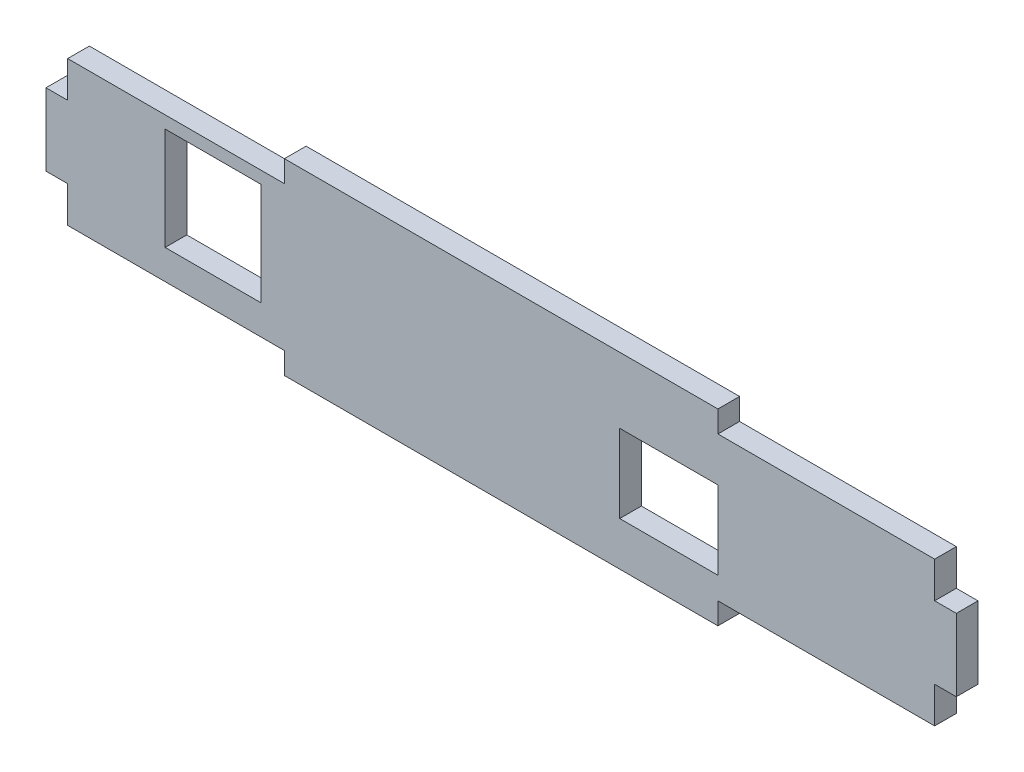
ISO-10303-21;
HEADER;
FILE_DESCRIPTION(('STEP AP214'),'2;1');
FILE_NAME('part.step','',(''),(''),'','','');
FILE_SCHEMA(('AUTOMOTIVE_DESIGN { 1 0 10303 214 1 1 1 1 }'));
ENDSEC;
DATA;
#1=APPLICATION_CONTEXT('core data for automotive mechanical design processes');
#2=APPLICATION_PROTOCOL_DEFINITION('international standard','automotive_design',2000,#1);
#3=PRODUCT_CONTEXT('',#1,'mechanical');
#4=PRODUCT('Part','Part','',(#3));
#5=PRODUCT_RELATED_PRODUCT_CATEGORY('part','',(#4));
#6=PRODUCT_DEFINITION_FORMATION('','',#4);
#7=PRODUCT_DEFINITION_CONTEXT('part definition',#1,'design');
#8=PRODUCT_DEFINITION('design','',#6,#7);
#9=PRODUCT_DEFINITION_SHAPE('','',#8);
#10=(LENGTH_UNIT() NAMED_UNIT(*) SI_UNIT(.MILLI.,.METRE.));
#11=(NAMED_UNIT(*) PLANE_ANGLE_UNIT() SI_UNIT($,.RADIAN.));
#12=(NAMED_UNIT(*) SI_UNIT($,.STERADIAN.) SOLID_ANGLE_UNIT());
#13=UNCERTAINTY_MEASURE_WITH_UNIT(LENGTH_MEASURE(1.E-05),#10,'distance_accuracy_value','');
#14=(GEOMETRIC_REPRESENTATION_CONTEXT(3) GLOBAL_UNCERTAINTY_ASSIGNED_CONTEXT((#13)) GLOBAL_UNIT_ASSIGNED_CONTEXT((#10,
#11,#12)) REPRESENTATION_CONTEXT('',''));
#15=CARTESIAN_POINT('',(0.,0.,0.));
#16=DIRECTION('',(0.,0.,1.));
#17=DIRECTION('',(1.,0.,0.));
#18=AXIS2_PLACEMENT_3D('',#15,#16,#17);
#19=CARTESIAN_POINT('',(0.,0.,3.));
#20=DIRECTION('',(0.,0.,-1.));
#21=DIRECTION('',(-1.,0.,0.));
#22=AXIS2_PLACEMENT_3D('',#19,#20,#21);
#23=PLANE('',#22);
#24=DIRECTION('',(0.,1.,0.));
#25=VECTOR('',#24,1.);
#26=CARTESIAN_POINT('',(26.7515675340596,18.2997167251893,3.));
#27=LINE('',#26,#25);
#28=CARTESIAN_POINT('',(26.7515675340596,4.10248715199374,3.));
#29=VERTEX_POINT('',#28);
#30=CARTESIAN_POINT('',(26.7515675340596,18.2997167251893,3.));
#31=VERTEX_POINT('',#30);
#32=EDGE_CURVE('E254',#29,#31,#27,.T.);
#33=ORIENTED_EDGE('',*,*,#32,.F.);
#34=DIRECTION('',(1.,0.,0.));
#35=VECTOR('',#34,1.);
#36=CARTESIAN_POINT('',(26.7515675340596,4.10248715199374,3.));
#37=LINE('',#36,#35);
#38=CARTESIAN_POINT('',(13.4899720015045,4.10248715199374,3.));
#39=VERTEX_POINT('',#38);
#40=EDGE_CURVE('E262',#39,#29,#37,.T.);
#41=ORIENTED_EDGE('',*,*,#40,.F.);
#42=DIRECTION('',(0.,-1.,0.));
#43=VECTOR('',#42,1.);
#44=CARTESIAN_POINT('',(13.4899720015045,18.2997167251893,3.));
#45=LINE('',#44,#43);
#46=CARTESIAN_POINT('',(13.4899720015045,18.2997167251893,3.));
#47=VERTEX_POINT('',#46);
#48=EDGE_CURVE('E259',#47,#39,#45,.T.);
#49=ORIENTED_EDGE('',*,*,#48,.F.);
#50=DIRECTION('',(-1.,0.,0.));
#51=VECTOR('',#50,1.);
#52=CARTESIAN_POINT('',(26.7515675340596,18.2997167251893,3.));
#53=LINE('',#52,#51);
#54=EDGE_CURVE('E256',#31,#47,#53,.T.);
#55=ORIENTED_EDGE('',*,*,#54,.F.);
#56=EDGE_LOOP('',(#33,#41,#49,#55));
#57=FACE_BOUND('',#56,.T.);
#58=DIRECTION('',(1.,0.,0.));
#59=VECTOR('',#58,1.);
#60=CARTESIAN_POINT('',(30.,0.,3.));
#61=LINE('',#60,#59);
#62=CARTESIAN_POINT('',(0.,0.,3.));
#63=VERTEX_POINT('',#62);
#64=CARTESIAN_POINT('',(30.,0.,3.));
#65=VERTEX_POINT('',#64);
#66=EDGE_CURVE('E285',#63,#65,#61,.T.);
#67=ORIENTED_EDGE('',*,*,#66,.T.);
#68=DIRECTION('',(0.,-1.,0.));
#69=VECTOR('',#68,1.);
#70=CARTESIAN_POINT('',(30.,-3.,3.));
#71=LINE('',#70,#69);
#72=CARTESIAN_POINT('',(30.,-3.,3.));
#73=VERTEX_POINT('',#72);
#74=EDGE_CURVE('E288',#65,#73,#71,.T.);
#75=ORIENTED_EDGE('',*,*,#74,.T.);
#76=DIRECTION('',(1.,0.,0.));
#77=VECTOR('',#76,1.);
#78=CARTESIAN_POINT('',(90.,-3.,3.));
#79=LINE('',#78,#77);
#80=CARTESIAN_POINT('',(90.,-3.,3.));
#81=VERTEX_POINT('',#80);
#82=EDGE_CURVE('E291',#73,#81,#79,.T.);
#83=ORIENTED_EDGE('',*,*,#82,.T.);
#84=DIRECTION('',(0.,1.,0.));
#85=VECTOR('',#84,1.);
#86=CARTESIAN_POINT('',(90.,0.,3.));
#87=LINE('',#86,#85);
#88=CARTESIAN_POINT('',(90.,0.,3.));
#89=VERTEX_POINT('',#88);
#90=EDGE_CURVE('E293',#81,#89,#87,.T.);
#91=ORIENTED_EDGE('',*,*,#90,.T.);
#92=DIRECTION('',(1.,0.,0.));
#93=VECTOR('',#92,1.);
#94=CARTESIAN_POINT('',(120.,0.,3.));
#95=LINE('',#94,#93);
#96=CARTESIAN_POINT('',(120.,0.,3.));
#97=VERTEX_POINT('',#96);
#98=EDGE_CURVE('E295',#89,#97,#95,.T.);
#99=ORIENTED_EDGE('',*,*,#98,.T.);
#100=DIRECTION('',(0.,1.,0.));
#101=VECTOR('',#100,1.);
#102=CARTESIAN_POINT('',(120.,5.00000000000001,3.));
#103=LINE('',#102,#101);
#104=CARTESIAN_POINT('',(120.,5.00000000000001,3.));
#105=VERTEX_POINT('',#104);
#106=EDGE_CURVE('E297',#97,#105,#103,.T.);
#107=ORIENTED_EDGE('',*,*,#106,.T.);
#108=DIRECTION('',(1.,0.,0.));
#109=VECTOR('',#108,1.);
#110=CARTESIAN_POINT('',(123.,5.00000000000001,3.));
#111=LINE('',#110,#109);
#112=CARTESIAN_POINT('',(123.,5.00000000000001,3.));
#113=VERTEX_POINT('',#112);
#114=EDGE_CURVE('E299',#105,#113,#111,.T.);
#115=ORIENTED_EDGE('',*,*,#114,.T.);
#116=DIRECTION('',(0.,1.,0.));
#117=VECTOR('',#116,1.);
#118=CARTESIAN_POINT('',(123.,15.,3.));
#119=LINE('',#118,#117);
#120=CARTESIAN_POINT('',(123.,15.,3.));
#121=VERTEX_POINT('',#120);
#122=EDGE_CURVE('E301',#113,#121,#119,.T.);
#123=ORIENTED_EDGE('',*,*,#122,.T.);
#124=DIRECTION('',(-1.,0.,0.));
#125=VECTOR('',#124,1.);
#126=CARTESIAN_POINT('',(120.,15.,3.));
#127=LINE('',#126,#125);
#128=CARTESIAN_POINT('',(120.,15.,3.));
#129=VERTEX_POINT('',#128);
#130=EDGE_CURVE('E303',#121,#129,#127,.T.);
#131=ORIENTED_EDGE('',*,*,#130,.T.);
#132=DIRECTION('',(0.,1.,0.));
#133=VECTOR('',#132,1.);
#134=CARTESIAN_POINT('',(120.,20.,3.));
#135=LINE('',#134,#133);
#136=CARTESIAN_POINT('',(120.,20.,3.));
#137=VERTEX_POINT('',#136);
#138=EDGE_CURVE('E305',#129,#137,#135,.T.);
#139=ORIENTED_EDGE('',*,*,#138,.T.);
#140=DIRECTION('',(-1.,0.,0.));
#141=VECTOR('',#140,1.);
#142=CARTESIAN_POINT('',(90.,20.,3.));
#143=LINE('',#142,#141);
#144=CARTESIAN_POINT('',(90.,20.,3.));
#145=VERTEX_POINT('',#144);
#146=EDGE_CURVE('E307',#137,#145,#143,.T.);
#147=ORIENTED_EDGE('',*,*,#146,.T.);
#148=DIRECTION('',(0.,1.,0.));
#149=VECTOR('',#148,1.);
#150=CARTESIAN_POINT('',(90.,23.,3.));
#151=LINE('',#150,#149);
#152=CARTESIAN_POINT('',(90.,23.,3.));
#153=VERTEX_POINT('',#152);
#154=EDGE_CURVE('E309',#145,#153,#151,.T.);
#155=ORIENTED_EDGE('',*,*,#154,.T.);
#156=DIRECTION('',(-1.,0.,0.));
#157=VECTOR('',#156,1.);
#158=CARTESIAN_POINT('',(30.,23.,3.));
#159=LINE('',#158,#157);
#160=CARTESIAN_POINT('',(30.,23.,3.));
#161=VERTEX_POINT('',#160);
#162=EDGE_CURVE('E311',#153,#161,#159,.T.);
#163=ORIENTED_EDGE('',*,*,#162,.T.);
#164=DIRECTION('',(0.,-1.,0.));
#165=VECTOR('',#164,1.);
#166=CARTESIAN_POINT('',(30.,20.,3.));
#167=LINE('',#166,#165);
#168=CARTESIAN_POINT('',(30.,20.,3.));
#169=VERTEX_POINT('',#168);
#170=EDGE_CURVE('E313',#161,#169,#167,.T.);
#171=ORIENTED_EDGE('',*,*,#170,.T.);
#172=DIRECTION('',(-1.,0.,0.));
#173=VECTOR('',#172,1.);
#174=CARTESIAN_POINT('',(0.,20.,3.));
#175=LINE('',#174,#173);
#176=CARTESIAN_POINT('',(0.,20.,3.));
#177=VERTEX_POINT('',#176);
#178=EDGE_CURVE('E315',#169,#177,#175,.T.);
#179=ORIENTED_EDGE('',*,*,#178,.T.);
#180=DIRECTION('',(0.,-1.,0.));
#181=VECTOR('',#180,1.);
#182=CARTESIAN_POINT('',(0.,15.,3.));
#183=LINE('',#182,#181);
#184=CARTESIAN_POINT('',(0.,15.,3.));
#185=VERTEX_POINT('',#184);
#186=EDGE_CURVE('E317',#177,#185,#183,.T.);
#187=ORIENTED_EDGE('',*,*,#186,.T.);
#188=DIRECTION('',(-1.,0.,0.));
#189=VECTOR('',#188,1.);
#190=CARTESIAN_POINT('',(-3.,15.,3.));
#191=LINE('',#190,#189);
#192=CARTESIAN_POINT('',(-3.,15.,3.));
#193=VERTEX_POINT('',#192);
#194=EDGE_CURVE('E319',#185,#193,#191,.T.);
#195=ORIENTED_EDGE('',*,*,#194,.T.);
#196=DIRECTION('',(0.,-1.,0.));
#197=VECTOR('',#196,1.);
#198=CARTESIAN_POINT('',(-3.,4.99999999999999,3.));
#199=LINE('',#198,#197);
#200=CARTESIAN_POINT('',(-3.,4.99999999999999,3.));
#201=VERTEX_POINT('',#200);
#202=EDGE_CURVE('E321',#193,#201,#199,.T.);
#203=ORIENTED_EDGE('',*,*,#202,.T.);
#204=DIRECTION('',(1.,0.,0.));
#205=VECTOR('',#204,1.);
#206=CARTESIAN_POINT('',(0.,4.99999999999999,3.));
#207=LINE('',#206,#205);
#208=CARTESIAN_POINT('',(0.,4.99999999999999,3.));
#209=VERTEX_POINT('',#208);
#210=EDGE_CURVE('E323',#201,#209,#207,.T.);
#211=ORIENTED_EDGE('',*,*,#210,.T.);
#212=DIRECTION('',(0.,-1.,0.));
#213=VECTOR('',#212,1.);
#214=CARTESIAN_POINT('',(0.,0.,3.));
#215=LINE('',#214,#213);
#216=EDGE_CURVE('E325',#209,#63,#215,.T.);
#217=ORIENTED_EDGE('',*,*,#216,.T.);
#218=EDGE_LOOP('',(#67,#75,#83,#91,#99,#107,#115,#123,#131,#139,#147,#155,#163,#171,#179,#187,
#195,#203,#211,#217));
#219=FACE_BOUND('',#218,.T.);
#220=DIRECTION('',(0.,1.,0.));
#221=VECTOR('',#220,1.);
#222=CARTESIAN_POINT('',(90.,13.8881165109244,3.));
#223=LINE('',#222,#221);
#224=CARTESIAN_POINT('',(90.,3.06662423825959,3.));
#225=VERTEX_POINT('',#224);
#226=CARTESIAN_POINT('',(90.,13.8881165109244,3.));
#227=VERTEX_POINT('',#226);
#228=EDGE_CURVE('E218',#225,#227,#223,.T.);
#229=ORIENTED_EDGE('',*,*,#228,.F.);
#230=DIRECTION('',(1.,0.,0.));
#231=VECTOR('',#230,1.);
#232=CARTESIAN_POINT('',(90.,3.06662423825959,3.));
#233=LINE('',#232,#231);
#234=CARTESIAN_POINT('',(76.4100716771545,3.06662423825959,3.));
#235=VERTEX_POINT('',#234);
#236=EDGE_CURVE('E240',#235,#225,#233,.T.);
#237=ORIENTED_EDGE('',*,*,#236,.F.);
#238=DIRECTION('',(0.,-1.,0.));
#239=VECTOR('',#238,1.);
#240=CARTESIAN_POINT('',(76.4100716771545,13.8881165109244,3.));
#241=LINE('',#240,#239);
#242=CARTESIAN_POINT('',(76.4100716771545,13.8881165109244,3.));
#243=VERTEX_POINT('',#242);
#244=EDGE_CURVE('E238',#243,#235,#241,.T.);
#245=ORIENTED_EDGE('',*,*,#244,.F.);
#246=DIRECTION('',(-1.,0.,0.));
#247=VECTOR('',#246,1.);
#248=CARTESIAN_POINT('',(90.,13.8881165109244,3.));
#249=LINE('',#248,#247);
#250=EDGE_CURVE('E226',#227,#243,#249,.T.);
#251=ORIENTED_EDGE('',*,*,#250,.F.);
#252=EDGE_LOOP('',(#229,#237,#245,#251));
#253=FACE_BOUND('',#252,.T.);
#254=ADVANCED_FACE('F33',(#57,#219,#253),#23,.F.);
#255=CARTESIAN_POINT('',(0.,0.,0.));
#256=DIRECTION('',(0.,0.,-1.));
#257=DIRECTION('',(-1.,0.,0.));
#258=AXIS2_PLACEMENT_3D('',#255,#256,#257);
#259=PLANE('',#258);
#260=DIRECTION('',(1.,0.,0.));
#261=VECTOR('',#260,1.);
#262=CARTESIAN_POINT('',(30.,0.,0.));
#263=LINE('',#262,#261);
#264=CARTESIAN_POINT('',(0.,0.,0.));
#265=VERTEX_POINT('',#264);
#266=CARTESIAN_POINT('',(30.,0.,0.));
#267=VERTEX_POINT('',#266);
#268=EDGE_CURVE('E284',#265,#267,#263,.T.);
#269=ORIENTED_EDGE('',*,*,#268,.F.);
#270=DIRECTION('',(0.,-1.,0.));
#271=VECTOR('',#270,1.);
#272=CARTESIAN_POINT('',(0.,0.,0.));
#273=LINE('',#272,#271);
#274=CARTESIAN_POINT('',(0.,4.99999999999999,0.));
#275=VERTEX_POINT('',#274);
#276=EDGE_CURVE('E289',#275,#265,#273,.T.);
#277=ORIENTED_EDGE('',*,*,#276,.F.);
#278=DIRECTION('',(1.,0.,0.));
#279=VECTOR('',#278,1.);
#280=CARTESIAN_POINT('',(0.,4.99999999999999,0.));
#281=LINE('',#280,#279);
#282=CARTESIAN_POINT('',(-3.,4.99999999999999,0.));
#283=VERTEX_POINT('',#282);
#284=EDGE_CURVE('E364',#283,#275,#281,.T.);
#285=ORIENTED_EDGE('',*,*,#284,.F.);
#286=DIRECTION('',(0.,-1.,0.));
#287=VECTOR('',#286,1.);
#288=CARTESIAN_POINT('',(-3.,4.99999999999999,0.));
#289=LINE('',#288,#287);
#290=CARTESIAN_POINT('',(-3.,15.,0.));
#291=VERTEX_POINT('',#290);
#292=EDGE_CURVE('E362',#291,#283,#289,.T.);
#293=ORIENTED_EDGE('',*,*,#292,.F.);
#294=DIRECTION('',(-1.,0.,0.));
#295=VECTOR('',#294,1.);
#296=CARTESIAN_POINT('',(-3.,15.,0.));
#297=LINE('',#296,#295);
#298=CARTESIAN_POINT('',(0.,15.,0.));
#299=VERTEX_POINT('',#298);
#300=EDGE_CURVE('E360',#299,#291,#297,.T.);
#301=ORIENTED_EDGE('',*,*,#300,.F.);
#302=DIRECTION('',(0.,-1.,0.));
#303=VECTOR('',#302,1.);
#304=CARTESIAN_POINT('',(0.,15.,0.));
#305=LINE('',#304,#303);
#306=CARTESIAN_POINT('',(0.,20.,0.));
#307=VERTEX_POINT('',#306);
#308=EDGE_CURVE('E358',#307,#299,#305,.T.);
#309=ORIENTED_EDGE('',*,*,#308,.F.);
#310=DIRECTION('',(-1.,0.,0.));
#311=VECTOR('',#310,1.);
#312=CARTESIAN_POINT('',(0.,20.,0.));
#313=LINE('',#312,#311);
#314=CARTESIAN_POINT('',(30.,20.,0.));
#315=VERTEX_POINT('',#314);
#316=EDGE_CURVE('E356',#315,#307,#313,.T.);
#317=ORIENTED_EDGE('',*,*,#316,.F.);
#318=DIRECTION('',(0.,-1.,0.));
#319=VECTOR('',#318,1.);
#320=CARTESIAN_POINT('',(30.,20.,0.));
#321=LINE('',#320,#319);
#322=CARTESIAN_POINT('',(30.,23.,0.));
#323=VERTEX_POINT('',#322);
#324=EDGE_CURVE('E354',#323,#315,#321,.T.);
#325=ORIENTED_EDGE('',*,*,#324,.F.);
#326=DIRECTION('',(-1.,0.,0.));
#327=VECTOR('',#326,1.);
#328=CARTESIAN_POINT('',(30.,23.,0.));
#329=LINE('',#328,#327);
#330=CARTESIAN_POINT('',(90.,23.,0.));
#331=VERTEX_POINT('',#330);
#332=EDGE_CURVE('E352',#331,#323,#329,.T.);
#333=ORIENTED_EDGE('',*,*,#332,.F.);
#334=DIRECTION('',(0.,1.,0.));
#335=VECTOR('',#334,1.);
#336=CARTESIAN_POINT('',(90.,23.,0.));
#337=LINE('',#336,#335);
#338=CARTESIAN_POINT('',(90.,20.,0.));
#339=VERTEX_POINT('',#338);
#340=EDGE_CURVE('E350',#339,#331,#337,.T.);
#341=ORIENTED_EDGE('',*,*,#340,.F.);
#342=DIRECTION('',(-1.,0.,0.));
#343=VECTOR('',#342,1.);
#344=CARTESIAN_POINT('',(90.,20.,0.));
#345=LINE('',#344,#343);
#346=CARTESIAN_POINT('',(120.,20.,0.));
#347=VERTEX_POINT('',#346);
#348=EDGE_CURVE('E348',#347,#339,#345,.T.);
#349=ORIENTED_EDGE('',*,*,#348,.F.);
#350=DIRECTION('',(0.,1.,0.));
#351=VECTOR('',#350,1.);
#352=CARTESIAN_POINT('',(120.,20.,0.));
#353=LINE('',#352,#351);
#354=CARTESIAN_POINT('',(120.,15.,0.));
#355=VERTEX_POINT('',#354);
#356=EDGE_CURVE('E346',#355,#347,#353,.T.);
#357=ORIENTED_EDGE('',*,*,#356,.F.);
#358=DIRECTION('',(-1.,0.,0.));
#359=VECTOR('',#358,1.);
#360=CARTESIAN_POINT('',(120.,15.,0.));
#361=LINE('',#360,#359);
#362=CARTESIAN_POINT('',(123.,15.,0.));
#363=VERTEX_POINT('',#362);
#364=EDGE_CURVE('E344',#363,#355,#361,.T.);
#365=ORIENTED_EDGE('',*,*,#364,.F.);
#366=DIRECTION('',(0.,1.,0.));
#367=VECTOR('',#366,1.);
#368=CARTESIAN_POINT('',(123.,15.,0.));
#369=LINE('',#368,#367);
#370=CARTESIAN_POINT('',(123.,5.00000000000001,0.));
#371=VERTEX_POINT('',#370);
#372=EDGE_CURVE('E342',#371,#363,#369,.T.);
#373=ORIENTED_EDGE('',*,*,#372,.F.);
#374=DIRECTION('',(1.,0.,0.));
#375=VECTOR('',#374,1.);
#376=CARTESIAN_POINT('',(123.,5.00000000000001,0.));
#377=LINE('',#376,#375);
#378=CARTESIAN_POINT('',(120.,5.00000000000001,0.));
#379=VERTEX_POINT('',#378);
#380=EDGE_CURVE('E340',#379,#371,#377,.T.);
#381=ORIENTED_EDGE('',*,*,#380,.F.);
#382=DIRECTION('',(0.,1.,0.));
#383=VECTOR('',#382,1.);
#384=CARTESIAN_POINT('',(120.,5.00000000000001,0.));
#385=LINE('',#384,#383);
#386=CARTESIAN_POINT('',(120.,0.,0.));
#387=VERTEX_POINT('',#386);
#388=EDGE_CURVE('E338',#387,#379,#385,.T.);
#389=ORIENTED_EDGE('',*,*,#388,.F.);
#390=DIRECTION('',(1.,0.,0.));
#391=VECTOR('',#390,1.);
#392=CARTESIAN_POINT('',(120.,0.,0.));
#393=LINE('',#392,#391);
#394=CARTESIAN_POINT('',(90.,0.,0.));
#395=VERTEX_POINT('',#394);
#396=EDGE_CURVE('E336',#395,#387,#393,.T.);
#397=ORIENTED_EDGE('',*,*,#396,.F.);
#398=DIRECTION('',(0.,1.,0.));
#399=VECTOR('',#398,1.);
#400=CARTESIAN_POINT('',(90.,0.,0.));
#401=LINE('',#400,#399);
#402=CARTESIAN_POINT('',(90.,-3.,0.));
#403=VERTEX_POINT('',#402);
#404=EDGE_CURVE('E334',#403,#395,#401,.T.);
#405=ORIENTED_EDGE('',*,*,#404,.F.);
#406=DIRECTION('',(1.,0.,0.));
#407=VECTOR('',#406,1.);
#408=CARTESIAN_POINT('',(90.,-3.,0.));
#409=LINE('',#408,#407);
#410=CARTESIAN_POINT('',(30.,-3.,0.));
#411=VERTEX_POINT('',#410);
#412=EDGE_CURVE('E332',#411,#403,#409,.T.);
#413=ORIENTED_EDGE('',*,*,#412,.F.);
#414=DIRECTION('',(0.,-1.,0.));
#415=VECTOR('',#414,1.);
#416=CARTESIAN_POINT('',(30.,-3.,0.));
#417=LINE('',#416,#415);
#418=EDGE_CURVE('E330',#267,#411,#417,.T.);
#419=ORIENTED_EDGE('',*,*,#418,.F.);
#420=EDGE_LOOP('',(#269,#277,#285,#293,#301,#309,#317,#325,#333,#341,#349,#357,#365,#373,#381,
#389,#397,#405,#413,#419));
#421=FACE_BOUND('',#420,.T.);
#422=DIRECTION('',(1.,0.,0.));
#423=VECTOR('',#422,1.);
#424=CARTESIAN_POINT('',(26.7515675340596,4.10248715199374,0.));
#425=LINE('',#424,#423);
#426=CARTESIAN_POINT('',(13.4899720015045,4.10248715199374,0.));
#427=VERTEX_POINT('',#426);
#428=CARTESIAN_POINT('',(26.7515675340596,4.10248715199374,0.));
#429=VERTEX_POINT('',#428);
#430=EDGE_CURVE('E257',#427,#429,#425,.T.);
#431=ORIENTED_EDGE('',*,*,#430,.T.);
#432=DIRECTION('',(0.,1.,0.));
#433=VECTOR('',#432,1.);
#434=CARTESIAN_POINT('',(26.7515675340596,18.2997167251893,0.));
#435=LINE('',#434,#433);
#436=CARTESIAN_POINT('',(26.7515675340596,18.2997167251893,0.));
#437=VERTEX_POINT('',#436);
#438=EDGE_CURVE('E234',#429,#437,#435,.T.);
#439=ORIENTED_EDGE('',*,*,#438,.T.);
#440=DIRECTION('',(-1.,0.,0.));
#441=VECTOR('',#440,1.);
#442=CARTESIAN_POINT('',(26.7515675340596,18.2997167251893,0.));
#443=LINE('',#442,#441);
#444=CARTESIAN_POINT('',(13.4899720015045,18.2997167251893,0.));
#445=VERTEX_POINT('',#444);
#446=EDGE_CURVE('E267',#437,#445,#443,.T.);
#447=ORIENTED_EDGE('',*,*,#446,.T.);
#448=DIRECTION('',(0.,-1.,0.));
#449=VECTOR('',#448,1.);
#450=CARTESIAN_POINT('',(13.4899720015045,18.2997167251893,0.));
#451=LINE('',#450,#449);
#452=EDGE_CURVE('E270',#445,#427,#451,.T.);
#453=ORIENTED_EDGE('',*,*,#452,.T.);
#454=EDGE_LOOP('',(#431,#439,#447,#453));
#455=FACE_BOUND('',#454,.T.);
#456=DIRECTION('',(1.,0.,0.));
#457=VECTOR('',#456,1.);
#458=CARTESIAN_POINT('',(90.,3.06662423825959,0.));
#459=LINE('',#458,#457);
#460=CARTESIAN_POINT('',(76.4100716771545,3.06662423825959,0.));
#461=VERTEX_POINT('',#460);
#462=CARTESIAN_POINT('',(90.,3.06662423825959,0.));
#463=VERTEX_POINT('',#462);
#464=EDGE_CURVE('E227',#461,#463,#459,.T.);
#465=ORIENTED_EDGE('',*,*,#464,.T.);
#466=DIRECTION('',(0.,1.,0.));
#467=VECTOR('',#466,1.);
#468=CARTESIAN_POINT('',(90.,13.8881165109244,0.));
#469=LINE('',#468,#467);
#470=CARTESIAN_POINT('',(90.,13.8881165109244,0.));
#471=VERTEX_POINT('',#470);
#472=EDGE_CURVE('E56',#463,#471,#469,.T.);
#473=ORIENTED_EDGE('',*,*,#472,.T.);
#474=DIRECTION('',(-1.,0.,0.));
#475=VECTOR('',#474,1.);
#476=CARTESIAN_POINT('',(90.,13.8881165109244,0.));
#477=LINE('',#476,#475);
#478=CARTESIAN_POINT('',(76.4100716771545,13.8881165109244,0.));
#479=VERTEX_POINT('',#478);
#480=EDGE_CURVE('E233',#471,#479,#477,.T.);
#481=ORIENTED_EDGE('',*,*,#480,.T.);
#482=DIRECTION('',(0.,-1.,0.));
#483=VECTOR('',#482,1.);
#484=CARTESIAN_POINT('',(76.4100716771545,13.8881165109244,0.));
#485=LINE('',#484,#483);
#486=EDGE_CURVE('E246',#479,#461,#485,.T.);
#487=ORIENTED_EDGE('',*,*,#486,.T.);
#488=EDGE_LOOP('',(#465,#473,#481,#487));
#489=FACE_BOUND('',#488,.T.);
#490=ADVANCED_FACE('F430',(#421,#455,#489),#259,.T.);
#491=CARTESIAN_POINT('',(30.,0.,3.));
#492=DIRECTION('',(0.,1.,0.));
#493=DIRECTION('',(-1.,0.,0.));
#494=AXIS2_PLACEMENT_3D('',#491,#492,#493);
#495=PLANE('',#494);
#496=ORIENTED_EDGE('',*,*,#268,.T.);
#497=DIRECTION('',(0.,0.,-1.));
#498=VECTOR('',#497,1.);
#499=CARTESIAN_POINT('',(30.,0.,3.));
#500=LINE('',#499,#498);
#501=EDGE_CURVE('E11',#65,#267,#500,.T.);
#502=ORIENTED_EDGE('',*,*,#501,.F.);
#503=ORIENTED_EDGE('',*,*,#66,.F.);
#504=DIRECTION('',(0.,0.,-1.));
#505=VECTOR('',#504,1.);
#506=CARTESIAN_POINT('',(0.,0.,3.));
#507=LINE('',#506,#505);
#508=EDGE_CURVE('E327',#63,#265,#507,.T.);
#509=ORIENTED_EDGE('',*,*,#508,.T.);
#510=EDGE_LOOP('',(#496,#502,#503,#509));
#511=FACE_BOUND('',#510,.T.);
#512=ADVANCED_FACE('F35',(#511),#495,.F.);
#513=CARTESIAN_POINT('',(30.,-3.,3.));
#514=DIRECTION('',(1.,0.,0.));
#515=DIRECTION('',(0.,0.,-1.));
#516=AXIS2_PLACEMENT_3D('',#513,#514,#515);
#517=PLANE('',#516);
#518=ORIENTED_EDGE('',*,*,#418,.T.);
#519=DIRECTION('',(0.,0.,-1.));
#520=VECTOR('',#519,1.);
#521=CARTESIAN_POINT('',(30.,-3.,3.));
#522=LINE('',#521,#520);
#523=EDGE_CURVE('E41',#73,#411,#522,.T.);
#524=ORIENTED_EDGE('',*,*,#523,.F.);
#525=ORIENTED_EDGE('',*,*,#74,.F.);
#526=ORIENTED_EDGE('',*,*,#501,.T.);
#527=EDGE_LOOP('',(#518,#524,#525,#526));
#528=FACE_BOUND('',#527,.T.);
#529=ADVANCED_FACE('F447',(#528),#517,.F.);
#530=CARTESIAN_POINT('',(90.,-3.,3.));
#531=DIRECTION('',(0.,1.,0.));
#532=DIRECTION('',(-1.,0.,0.));
#533=AXIS2_PLACEMENT_3D('',#530,#531,#532);
#534=PLANE('',#533);
#535=ORIENTED_EDGE('',*,*,#412,.T.);
#536=DIRECTION('',(0.,0.,-1.));
#537=VECTOR('',#536,1.);
#538=CARTESIAN_POINT('',(90.,-3.,3.));
#539=LINE('',#538,#537);
#540=EDGE_CURVE('E417',#81,#403,#539,.T.);
#541=ORIENTED_EDGE('',*,*,#540,.F.);
#542=ORIENTED_EDGE('',*,*,#82,.F.);
#543=ORIENTED_EDGE('',*,*,#523,.T.);
#544=EDGE_LOOP('',(#535,#541,#542,#543));
#545=FACE_BOUND('',#544,.T.);
#546=ADVANCED_FACE('F424',(#545),#534,.F.);
#547=CARTESIAN_POINT('',(90.,0.,3.));
#548=DIRECTION('',(-1.,0.,0.));
#549=DIRECTION('',(0.,0.,1.));
#550=AXIS2_PLACEMENT_3D('',#547,#548,#549);
#551=PLANE('',#550);
#552=ORIENTED_EDGE('',*,*,#404,.T.);
#553=DIRECTION('',(0.,0.,-1.));
#554=VECTOR('',#553,1.);
#555=CARTESIAN_POINT('',(90.,0.,3.));
#556=LINE('',#555,#554);
#557=EDGE_CURVE('E414',#89,#395,#556,.T.);
#558=ORIENTED_EDGE('',*,*,#557,.F.);
#559=ORIENTED_EDGE('',*,*,#90,.F.);
#560=ORIENTED_EDGE('',*,*,#540,.T.);
#561=EDGE_LOOP('',(#552,#558,#559,#560));
#562=FACE_BOUND('',#561,.T.);
#563=ADVANCED_FACE('F436',(#562),#551,.F.);
#564=CARTESIAN_POINT('',(120.,0.,3.));
#565=DIRECTION('',(0.,1.,0.));
#566=DIRECTION('',(0.,0.,1.));
#567=AXIS2_PLACEMENT_3D('',#564,#565,#566);
#568=PLANE('',#567);
#569=ORIENTED_EDGE('',*,*,#396,.T.);
#570=DIRECTION('',(0.,0.,-1.));
#571=VECTOR('',#570,1.);
#572=CARTESIAN_POINT('',(120.,0.,3.));
#573=LINE('',#572,#571);
#574=EDGE_CURVE('E411',#97,#387,#573,.T.);
#575=ORIENTED_EDGE('',*,*,#574,.F.);
#576=ORIENTED_EDGE('',*,*,#98,.F.);
#577=ORIENTED_EDGE('',*,*,#557,.T.);
#578=EDGE_LOOP('',(#569,#575,#576,#577));
#579=FACE_BOUND('',#578,.T.);
#580=ADVANCED_FACE('F440',(#579),#568,.F.);
#581=CARTESIAN_POINT('',(120.,5.00000000000001,3.));
#582=DIRECTION('',(-1.,0.,0.));
#583=DIRECTION('',(0.,0.,1.));
#584=AXIS2_PLACEMENT_3D('',#581,#582,#583);
#585=PLANE('',#584);
#586=ORIENTED_EDGE('',*,*,#388,.T.);
#587=DIRECTION('',(0.,0.,-1.));
#588=VECTOR('',#587,1.);
#589=CARTESIAN_POINT('',(120.,5.00000000000001,3.));
#590=LINE('',#589,#588);
#591=EDGE_CURVE('E408',#105,#379,#590,.T.);
#592=ORIENTED_EDGE('',*,*,#591,.F.);
#593=ORIENTED_EDGE('',*,*,#106,.F.);
#594=ORIENTED_EDGE('',*,*,#574,.T.);
#595=EDGE_LOOP('',(#586,#592,#593,#594));
#596=FACE_BOUND('',#595,.T.);
#597=ADVANCED_FACE('F520',(#596),#585,.F.);
#598=CARTESIAN_POINT('',(123.,5.00000000000001,3.));
#599=DIRECTION('',(0.,1.,0.));
#600=DIRECTION('',(-1.,0.,0.));
#601=AXIS2_PLACEMENT_3D('',#598,#599,#600);
#602=PLANE('',#601);
#603=ORIENTED_EDGE('',*,*,#380,.T.);
#604=DIRECTION('',(0.,0.,-1.));
#605=VECTOR('',#604,1.);
#606=CARTESIAN_POINT('',(123.,5.00000000000001,3.));
#607=LINE('',#606,#605);
#608=EDGE_CURVE('E405',#113,#371,#607,.T.);
#609=ORIENTED_EDGE('',*,*,#608,.F.);
#610=ORIENTED_EDGE('',*,*,#114,.F.);
#611=ORIENTED_EDGE('',*,*,#591,.T.);
#612=EDGE_LOOP('',(#603,#609,#610,#611));
#613=FACE_BOUND('',#612,.T.);
#614=ADVANCED_FACE('F518',(#613),#602,.F.);
#615=CARTESIAN_POINT('',(123.,15.,3.));
#616=DIRECTION('',(-1.,0.,0.));
#617=DIRECTION('',(0.,0.,1.));
#618=AXIS2_PLACEMENT_3D('',#615,#616,#617);
#619=PLANE('',#618);
#620=ORIENTED_EDGE('',*,*,#372,.T.);
#621=DIRECTION('',(0.,0.,-1.));
#622=VECTOR('',#621,1.);
#623=CARTESIAN_POINT('',(123.,15.,3.));
#624=LINE('',#623,#622);
#625=EDGE_CURVE('E402',#121,#363,#624,.T.);
#626=ORIENTED_EDGE('',*,*,#625,.F.);
#627=ORIENTED_EDGE('',*,*,#122,.F.);
#628=ORIENTED_EDGE('',*,*,#608,.T.);
#629=EDGE_LOOP('',(#620,#626,#627,#628));
#630=FACE_BOUND('',#629,.T.);
#631=ADVANCED_FACE('F513',(#630),#619,.F.);
#632=CARTESIAN_POINT('',(120.,15.,3.));
#633=DIRECTION('',(0.,-1.,0.));
#634=DIRECTION('',(0.,0.,-1.));
#635=AXIS2_PLACEMENT_3D('',#632,#633,#634);
#636=PLANE('',#635);
#637=ORIENTED_EDGE('',*,*,#364,.T.);
#638=DIRECTION('',(0.,0.,-1.));
#639=VECTOR('',#638,1.);
#640=CARTESIAN_POINT('',(120.,15.,3.));
#641=LINE('',#640,#639);
#642=EDGE_CURVE('E399',#129,#355,#641,.T.);
#643=ORIENTED_EDGE('',*,*,#642,.F.);
#644=ORIENTED_EDGE('',*,*,#130,.F.);
#645=ORIENTED_EDGE('',*,*,#625,.T.);
#646=EDGE_LOOP('',(#637,#643,#644,#645));
#647=FACE_BOUND('',#646,.T.);
#648=ADVANCED_FACE('F508',(#647),#636,.F.);
#649=CARTESIAN_POINT('',(120.,20.,3.));
#650=DIRECTION('',(-1.,0.,0.));
#651=DIRECTION('',(0.,0.,1.));
#652=AXIS2_PLACEMENT_3D('',#649,#650,#651);
#653=PLANE('',#652);
#654=ORIENTED_EDGE('',*,*,#356,.T.);
#655=DIRECTION('',(0.,0.,-1.));
#656=VECTOR('',#655,1.);
#657=CARTESIAN_POINT('',(120.,20.,3.));
#658=LINE('',#657,#656);
#659=EDGE_CURVE('E396',#137,#347,#658,.T.);
#660=ORIENTED_EDGE('',*,*,#659,.F.);
#661=ORIENTED_EDGE('',*,*,#138,.F.);
#662=ORIENTED_EDGE('',*,*,#642,.T.);
#663=EDGE_LOOP('',(#654,#660,#661,#662));
#664=FACE_BOUND('',#663,.T.);
#665=ADVANCED_FACE('F504',(#664),#653,.F.);
#666=CARTESIAN_POINT('',(90.,20.,3.));
#667=DIRECTION('',(0.,-1.,0.));
#668=DIRECTION('',(0.,0.,-1.));
#669=AXIS2_PLACEMENT_3D('',#666,#667,#668);
#670=PLANE('',#669);
#671=ORIENTED_EDGE('',*,*,#348,.T.);
#672=DIRECTION('',(0.,0.,-1.));
#673=VECTOR('',#672,1.);
#674=CARTESIAN_POINT('',(90.,20.,3.));
#675=LINE('',#674,#673);
#676=EDGE_CURVE('E393',#145,#339,#675,.T.);
#677=ORIENTED_EDGE('',*,*,#676,.F.);
#678=ORIENTED_EDGE('',*,*,#146,.F.);
#679=ORIENTED_EDGE('',*,*,#659,.T.);
#680=EDGE_LOOP('',(#671,#677,#678,#679));
#681=FACE_BOUND('',#680,.T.);
#682=ADVANCED_FACE('F499',(#681),#670,.F.);
#683=CARTESIAN_POINT('',(90.,23.,3.));
#684=DIRECTION('',(-1.,0.,0.));
#685=DIRECTION('',(0.,-1.,0.));
#686=AXIS2_PLACEMENT_3D('',#683,#684,#685);
#687=PLANE('',#686);
#688=ORIENTED_EDGE('',*,*,#340,.T.);
#689=DIRECTION('',(0.,0.,-1.));
#690=VECTOR('',#689,1.);
#691=CARTESIAN_POINT('',(90.,23.,3.));
#692=LINE('',#691,#690);
#693=EDGE_CURVE('E390',#153,#331,#692,.T.);
#694=ORIENTED_EDGE('',*,*,#693,.F.);
#695=ORIENTED_EDGE('',*,*,#154,.F.);
#696=ORIENTED_EDGE('',*,*,#676,.T.);
#697=EDGE_LOOP('',(#688,#694,#695,#696));
#698=FACE_BOUND('',#697,.T.);
#699=ADVANCED_FACE('F493',(#698),#687,.F.);
#700=CARTESIAN_POINT('',(30.,23.,3.));
#701=DIRECTION('',(0.,-1.,0.));
#702=DIRECTION('',(1.,0.,0.));
#703=AXIS2_PLACEMENT_3D('',#700,#701,#702);
#704=PLANE('',#703);
#705=ORIENTED_EDGE('',*,*,#332,.T.);
#706=DIRECTION('',(0.,0.,-1.));
#707=VECTOR('',#706,1.);
#708=CARTESIAN_POINT('',(30.,23.,3.));
#709=LINE('',#708,#707);
#710=EDGE_CURVE('E387',#161,#323,#709,.T.);
#711=ORIENTED_EDGE('',*,*,#710,.F.);
#712=ORIENTED_EDGE('',*,*,#162,.F.);
#713=ORIENTED_EDGE('',*,*,#693,.T.);
#714=EDGE_LOOP('',(#705,#711,#712,#713));
#715=FACE_BOUND('',#714,.T.);
#716=ADVANCED_FACE('F489',(#715),#704,.F.);
#717=CARTESIAN_POINT('',(30.,20.,3.));
#718=DIRECTION('',(1.,0.,0.));
#719=DIRECTION('',(0.,0.,-1.));
#720=AXIS2_PLACEMENT_3D('',#717,#718,#719);
#721=PLANE('',#720);
#722=ORIENTED_EDGE('',*,*,#324,.T.);
#723=DIRECTION('',(0.,0.,-1.));
#724=VECTOR('',#723,1.);
#725=CARTESIAN_POINT('',(30.,20.,3.));
#726=LINE('',#725,#724);
#727=EDGE_CURVE('E384',#169,#315,#726,.T.);
#728=ORIENTED_EDGE('',*,*,#727,.F.);
#729=ORIENTED_EDGE('',*,*,#170,.F.);
#730=ORIENTED_EDGE('',*,*,#710,.T.);
#731=EDGE_LOOP('',(#722,#728,#729,#730));
#732=FACE_BOUND('',#731,.T.);
#733=ADVANCED_FACE('F484',(#732),#721,.F.);
#734=CARTESIAN_POINT('',(0.,20.,3.));
#735=DIRECTION('',(0.,-1.,0.));
#736=DIRECTION('',(0.,0.,-1.));
#737=AXIS2_PLACEMENT_3D('',#734,#735,#736);
#738=PLANE('',#737);
#739=ORIENTED_EDGE('',*,*,#316,.T.);
#740=DIRECTION('',(0.,0.,-1.));
#741=VECTOR('',#740,1.);
#742=CARTESIAN_POINT('',(0.,20.,3.));
#743=LINE('',#742,#741);
#744=EDGE_CURVE('E381',#177,#307,#743,.T.);
#745=ORIENTED_EDGE('',*,*,#744,.F.);
#746=ORIENTED_EDGE('',*,*,#178,.F.);
#747=ORIENTED_EDGE('',*,*,#727,.T.);
#748=EDGE_LOOP('',(#739,#745,#746,#747));
#749=FACE_BOUND('',#748,.T.);
#750=ADVANCED_FACE('F478',(#749),#738,.F.);
#751=CARTESIAN_POINT('',(0.,15.,3.));
#752=DIRECTION('',(1.,0.,0.));
#753=DIRECTION('',(0.,1.,0.));
#754=AXIS2_PLACEMENT_3D('',#751,#752,#753);
#755=PLANE('',#754);
#756=ORIENTED_EDGE('',*,*,#308,.T.);
#757=DIRECTION('',(0.,0.,-1.));
#758=VECTOR('',#757,1.);
#759=CARTESIAN_POINT('',(0.,15.,3.));
#760=LINE('',#759,#758);
#761=EDGE_CURVE('E378',#185,#299,#760,.T.);
#762=ORIENTED_EDGE('',*,*,#761,.F.);
#763=ORIENTED_EDGE('',*,*,#186,.F.);
#764=ORIENTED_EDGE('',*,*,#744,.T.);
#765=EDGE_LOOP('',(#756,#762,#763,#764));
#766=FACE_BOUND('',#765,.T.);
#767=ADVANCED_FACE('F474',(#766),#755,.F.);
#768=CARTESIAN_POINT('',(-3.,15.,3.));
#769=DIRECTION('',(0.,-1.,0.));
#770=DIRECTION('',(0.,0.,-1.));
#771=AXIS2_PLACEMENT_3D('',#768,#769,#770);
#772=PLANE('',#771);
#773=ORIENTED_EDGE('',*,*,#300,.T.);
#774=DIRECTION('',(0.,0.,-1.));
#775=VECTOR('',#774,1.);
#776=CARTESIAN_POINT('',(-3.,15.,3.));
#777=LINE('',#776,#775);
#778=EDGE_CURVE('E375',#193,#291,#777,.T.);
#779=ORIENTED_EDGE('',*,*,#778,.F.);
#780=ORIENTED_EDGE('',*,*,#194,.F.);
#781=ORIENTED_EDGE('',*,*,#761,.T.);
#782=EDGE_LOOP('',(#773,#779,#780,#781));
#783=FACE_BOUND('',#782,.T.);
#784=ADVANCED_FACE('F469',(#783),#772,.F.);
#785=CARTESIAN_POINT('',(-3.,4.99999999999999,3.));
#786=DIRECTION('',(1.,0.,0.));
#787=DIRECTION('',(0.,1.,0.));
#788=AXIS2_PLACEMENT_3D('',#785,#786,#787);
#789=PLANE('',#788);
#790=ORIENTED_EDGE('',*,*,#292,.T.);
#791=DIRECTION('',(0.,0.,-1.));
#792=VECTOR('',#791,1.);
#793=CARTESIAN_POINT('',(-3.,4.99999999999999,3.));
#794=LINE('',#793,#792);
#795=EDGE_CURVE('E372',#201,#283,#794,.T.);
#796=ORIENTED_EDGE('',*,*,#795,.F.);
#797=ORIENTED_EDGE('',*,*,#202,.F.);
#798=ORIENTED_EDGE('',*,*,#778,.T.);
#799=EDGE_LOOP('',(#790,#796,#797,#798));
#800=FACE_BOUND('',#799,.T.);
#801=ADVANCED_FACE('F463',(#800),#789,.F.);
#802=CARTESIAN_POINT('',(0.,4.99999999999999,3.));
#803=DIRECTION('',(0.,1.,0.));
#804=DIRECTION('',(0.,0.,1.));
#805=AXIS2_PLACEMENT_3D('',#802,#803,#804);
#806=PLANE('',#805);
#807=ORIENTED_EDGE('',*,*,#284,.T.);
#808=DIRECTION('',(0.,0.,-1.));
#809=VECTOR('',#808,1.);
#810=CARTESIAN_POINT('',(0.,4.99999999999999,3.));
#811=LINE('',#810,#809);
#812=EDGE_CURVE('E369',#209,#275,#811,.T.);
#813=ORIENTED_EDGE('',*,*,#812,.F.);
#814=ORIENTED_EDGE('',*,*,#210,.F.);
#815=ORIENTED_EDGE('',*,*,#795,.T.);
#816=EDGE_LOOP('',(#807,#813,#814,#815));
#817=FACE_BOUND('',#816,.T.);
#818=ADVANCED_FACE('F459',(#817),#806,.F.);
#819=CARTESIAN_POINT('',(0.,0.,3.));
#820=DIRECTION('',(1.,0.,0.));
#821=DIRECTION('',(0.,1.,0.));
#822=AXIS2_PLACEMENT_3D('',#819,#820,#821);
#823=PLANE('',#822);
#824=ORIENTED_EDGE('',*,*,#276,.T.);
#825=ORIENTED_EDGE('',*,*,#508,.F.);
#826=ORIENTED_EDGE('',*,*,#216,.F.);
#827=ORIENTED_EDGE('',*,*,#812,.T.);
#828=EDGE_LOOP('',(#824,#825,#826,#827));
#829=FACE_BOUND('',#828,.T.);
#830=ADVANCED_FACE('F454',(#829),#823,.F.);
#831=CARTESIAN_POINT('',(26.7515675340596,18.2997167251893,3.));
#832=DIRECTION('',(-1.,0.,0.));
#833=DIRECTION('',(0.,0.,1.));
#834=AXIS2_PLACEMENT_3D('',#831,#832,#833);
#835=PLANE('',#834);
#836=ORIENTED_EDGE('',*,*,#438,.F.);
#837=DIRECTION('',(0.,0.,-1.));
#838=VECTOR('',#837,1.);
#839=CARTESIAN_POINT('',(26.7515675340596,4.10248715199374,3.));
#840=LINE('',#839,#838);
#841=EDGE_CURVE('E264',#29,#429,#840,.T.);
#842=ORIENTED_EDGE('',*,*,#841,.F.);
#843=ORIENTED_EDGE('',*,*,#32,.T.);
#844=DIRECTION('',(0.,0.,-1.));
#845=VECTOR('',#844,1.);
#846=CARTESIAN_POINT('',(26.7515675340596,18.2997167251893,3.));
#847=LINE('',#846,#845);
#848=EDGE_CURVE('E281',#31,#437,#847,.T.);
#849=ORIENTED_EDGE('',*,*,#848,.T.);
#850=EDGE_LOOP('',(#836,#842,#843,#849));
#851=FACE_BOUND('',#850,.T.);
#852=ADVANCED_FACE('F538',(#851),#835,.T.);
#853=CARTESIAN_POINT('',(26.7515675340596,18.2997167251893,3.));
#854=DIRECTION('',(0.,-1.,0.));
#855=DIRECTION('',(0.,0.,-1.));
#856=AXIS2_PLACEMENT_3D('',#853,#854,#855);
#857=PLANE('',#856);
#858=ORIENTED_EDGE('',*,*,#446,.F.);
#859=ORIENTED_EDGE('',*,*,#848,.F.);
#860=ORIENTED_EDGE('',*,*,#54,.T.);
#861=DIRECTION('',(0.,0.,-1.));
#862=VECTOR('',#861,1.);
#863=CARTESIAN_POINT('',(13.4899720015045,18.2997167251893,3.));
#864=LINE('',#863,#862);
#865=EDGE_CURVE('E279',#47,#445,#864,.T.);
#866=ORIENTED_EDGE('',*,*,#865,.T.);
#867=EDGE_LOOP('',(#858,#859,#860,#866));
#868=FACE_BOUND('',#867,.T.);
#869=ADVANCED_FACE('F624',(#868),#857,.T.);
#870=CARTESIAN_POINT('',(13.4899720015045,18.2997167251893,3.));
#871=DIRECTION('',(1.,0.,0.));
#872=DIRECTION('',(0.,0.,-1.));
#873=AXIS2_PLACEMENT_3D('',#870,#871,#872);
#874=PLANE('',#873);
#875=ORIENTED_EDGE('',*,*,#452,.F.);
#876=ORIENTED_EDGE('',*,*,#865,.F.);
#877=ORIENTED_EDGE('',*,*,#48,.T.);
#878=DIRECTION('',(0.,0.,-1.));
#879=VECTOR('',#878,1.);
#880=CARTESIAN_POINT('',(13.4899720015045,4.10248715199374,3.));
#881=LINE('',#880,#879);
#882=EDGE_CURVE('E277',#39,#427,#881,.T.);
#883=ORIENTED_EDGE('',*,*,#882,.T.);
#884=EDGE_LOOP('',(#875,#876,#877,#883));
#885=FACE_BOUND('',#884,.T.);
#886=ADVANCED_FACE('F631',(#885),#874,.T.);
#887=CARTESIAN_POINT('',(26.7515675340596,4.10248715199374,3.));
#888=DIRECTION('',(0.,1.,0.));
#889=DIRECTION('',(0.,0.,1.));
#890=AXIS2_PLACEMENT_3D('',#887,#888,#889);
#891=PLANE('',#890);
#892=ORIENTED_EDGE('',*,*,#430,.F.);
#893=ORIENTED_EDGE('',*,*,#882,.F.);
#894=ORIENTED_EDGE('',*,*,#40,.T.);
#895=ORIENTED_EDGE('',*,*,#841,.T.);
#896=EDGE_LOOP('',(#892,#893,#894,#895));
#897=FACE_BOUND('',#896,.T.);
#898=ADVANCED_FACE('F638',(#897),#891,.T.);
#899=CARTESIAN_POINT('',(90.,13.8881165109244,3.));
#900=DIRECTION('',(-1.,0.,0.));
#901=DIRECTION('',(0.,0.,1.));
#902=AXIS2_PLACEMENT_3D('',#899,#900,#901);
#903=PLANE('',#902);
#904=ORIENTED_EDGE('',*,*,#472,.F.);
#905=DIRECTION('',(0.,0.,-1.));
#906=VECTOR('',#905,1.);
#907=CARTESIAN_POINT('',(90.,3.06662423825959,3.));
#908=LINE('',#907,#906);
#909=EDGE_CURVE('E222',#225,#463,#908,.T.);
#910=ORIENTED_EDGE('',*,*,#909,.F.);
#911=ORIENTED_EDGE('',*,*,#228,.T.);
#912=DIRECTION('',(0.,0.,-1.));
#913=VECTOR('',#912,1.);
#914=CARTESIAN_POINT('',(90.,13.8881165109244,3.));
#915=LINE('',#914,#913);
#916=EDGE_CURVE('E221',#227,#471,#915,.T.);
#917=ORIENTED_EDGE('',*,*,#916,.T.);
#918=EDGE_LOOP('',(#904,#910,#911,#917));
#919=FACE_BOUND('',#918,.T.);
#920=ADVANCED_FACE('F220',(#919),#903,.T.);
#921=CARTESIAN_POINT('',(90.,13.8881165109244,3.));
#922=DIRECTION('',(0.,-1.,0.));
#923=DIRECTION('',(0.,0.,-1.));
#924=AXIS2_PLACEMENT_3D('',#921,#922,#923);
#925=PLANE('',#924);
#926=ORIENTED_EDGE('',*,*,#480,.F.);
#927=ORIENTED_EDGE('',*,*,#916,.F.);
#928=ORIENTED_EDGE('',*,*,#250,.T.);
#929=DIRECTION('',(0.,0.,-1.));
#930=VECTOR('',#929,1.);
#931=CARTESIAN_POINT('',(76.4100716771545,13.8881165109244,3.));
#932=LINE('',#931,#930);
#933=EDGE_CURVE('E235',#243,#479,#932,.T.);
#934=ORIENTED_EDGE('',*,*,#933,.T.);
#935=EDGE_LOOP('',(#926,#927,#928,#934));
#936=FACE_BOUND('',#935,.T.);
#937=ADVANCED_FACE('F230',(#936),#925,.T.);
#938=CARTESIAN_POINT('',(76.4100716771545,13.8881165109244,3.));
#939=DIRECTION('',(1.,0.,0.));
#940=DIRECTION('',(0.,0.,-1.));
#941=AXIS2_PLACEMENT_3D('',#938,#939,#940);
#942=PLANE('',#941);
#943=ORIENTED_EDGE('',*,*,#486,.F.);
#944=ORIENTED_EDGE('',*,*,#933,.F.);
#945=ORIENTED_EDGE('',*,*,#244,.T.);
#946=DIRECTION('',(0.,0.,-1.));
#947=VECTOR('',#946,1.);
#948=CARTESIAN_POINT('',(76.4100716771545,3.06662423825959,3.));
#949=LINE('',#948,#947);
#950=EDGE_CURVE('E48',#235,#461,#949,.T.);
#951=ORIENTED_EDGE('',*,*,#950,.T.);
#952=EDGE_LOOP('',(#943,#944,#945,#951));
#953=FACE_BOUND('',#952,.T.);
#954=ADVANCED_FACE('F659',(#953),#942,.T.);
#955=CARTESIAN_POINT('',(90.,3.06662423825959,3.));
#956=DIRECTION('',(0.,1.,0.));
#957=DIRECTION('',(0.,0.,1.));
#958=AXIS2_PLACEMENT_3D('',#955,#956,#957);
#959=PLANE('',#958);
#960=ORIENTED_EDGE('',*,*,#464,.F.);
#961=ORIENTED_EDGE('',*,*,#950,.F.);
#962=ORIENTED_EDGE('',*,*,#236,.T.);
#963=ORIENTED_EDGE('',*,*,#909,.T.);
#964=EDGE_LOOP('',(#960,#961,#962,#963));
#965=FACE_BOUND('',#964,.T.);
#966=ADVANCED_FACE('F666',(#965),#959,.T.);
#967=CLOSED_SHELL('',(#254,#490,#512,#529,#546,#563,#580,#597,#614,#631,#648,#665,#682,#699,
#716,#733,#750,#767,#784,#801,#818,#830,#852,#869,#886,#898,#920,#937,#954,#966));
#968=MANIFOLD_SOLID_BREP('B2',#967);
#969=ADVANCED_BREP_SHAPE_REPRESENTATION('',(#18,#968),#14);
#970=SHAPE_DEFINITION_REPRESENTATION(#9,#969);
ENDSEC;
END-ISO-10303-21;
